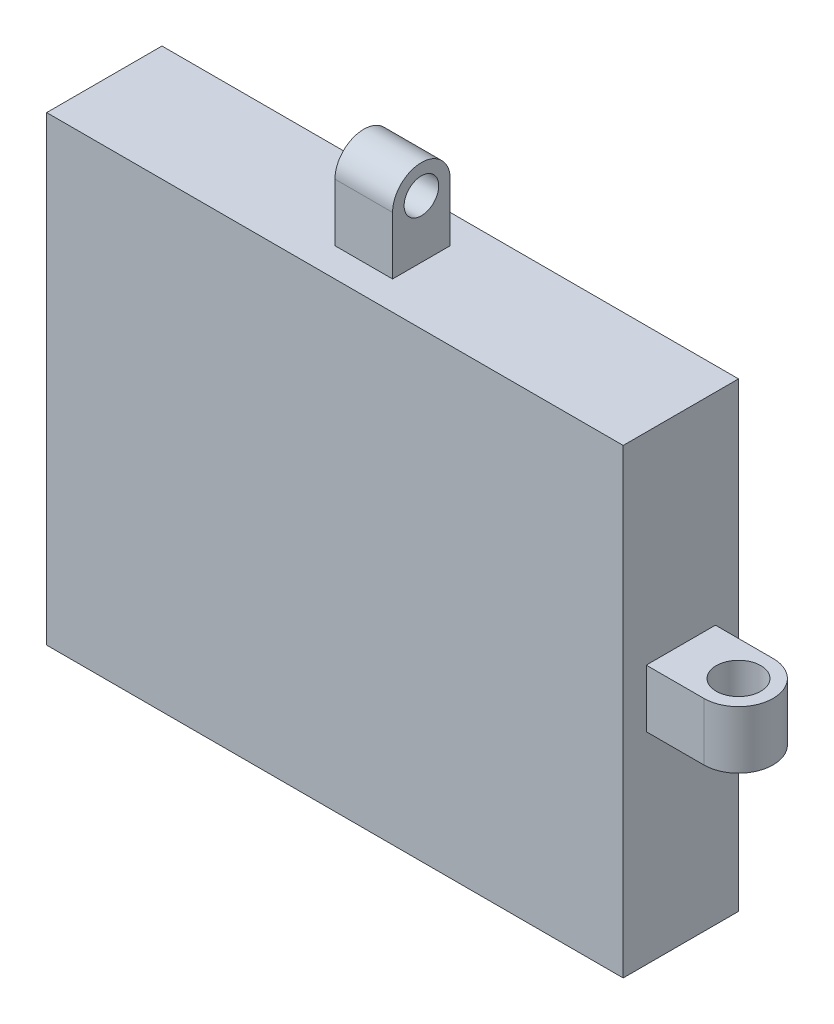
ISO-10303-21;
HEADER;
FILE_DESCRIPTION(('STEP AP214'),'2;1');
FILE_NAME('part.step','',(''),(''),'','','');
FILE_SCHEMA(('AUTOMOTIVE_DESIGN { 1 0 10303 214 1 1 1 1 }'));
ENDSEC;
DATA;
#1=APPLICATION_CONTEXT('core data for automotive mechanical design processes');
#2=APPLICATION_PROTOCOL_DEFINITION('international standard','automotive_design',2000,#1);
#3=PRODUCT_CONTEXT('',#1,'mechanical');
#4=PRODUCT('Part','Part','',(#3));
#5=PRODUCT_RELATED_PRODUCT_CATEGORY('part','',(#4));
#6=PRODUCT_DEFINITION_FORMATION('','',#4);
#7=PRODUCT_DEFINITION_CONTEXT('part definition',#1,'design');
#8=PRODUCT_DEFINITION('design','',#6,#7);
#9=PRODUCT_DEFINITION_SHAPE('','',#8);
#10=(LENGTH_UNIT() NAMED_UNIT(*) SI_UNIT(.MILLI.,.METRE.));
#11=(NAMED_UNIT(*) PLANE_ANGLE_UNIT() SI_UNIT($,.RADIAN.));
#12=(NAMED_UNIT(*) SI_UNIT($,.STERADIAN.) SOLID_ANGLE_UNIT());
#13=UNCERTAINTY_MEASURE_WITH_UNIT(LENGTH_MEASURE(1.E-05),#10,'distance_accuracy_value','');
#14=(GEOMETRIC_REPRESENTATION_CONTEXT(3) GLOBAL_UNCERTAINTY_ASSIGNED_CONTEXT((#13)) GLOBAL_UNIT_ASSIGNED_CONTEXT((#10,
#11,#12)) REPRESENTATION_CONTEXT('',''));
#15=CARTESIAN_POINT('',(0.,0.,0.));
#16=DIRECTION('',(0.,0.,1.));
#17=DIRECTION('',(1.,0.,0.));
#18=AXIS2_PLACEMENT_3D('',#15,#16,#17);
#19=CARTESIAN_POINT('',(3.38170104945569E-11,435.137931034487,0.));
#20=DIRECTION('',(0.,-1.,0.));
#21=DIRECTION('',(1.,0.,0.));
#22=AXIS2_PLACEMENT_3D('',#19,#20,#21);
#23=PLANE('',#22);
#24=CARTESIAN_POINT('',(28.531497042076,435.137931034485,5.00000000000001));
#25=DIRECTION('',(0.,1.,0.));
#26=DIRECTION('',(-1.,0.,0.));
#27=AXIS2_PLACEMENT_3D('',#24,#25,#26);
#28=CIRCLE('',#27,1.93089717066683);
#29=CARTESIAN_POINT('',(26.6005998714092,435.137931034485,5.00000000000001));
#30=VERTEX_POINT('',#29);
#31=EDGE_CURVE('E172',#30,#30,#28,.T.);
#32=ORIENTED_EDGE('',*,*,#31,.T.);
#33=EDGE_LOOP('',(#32));
#34=FACE_BOUND('',#33,.T.);
#35=DIRECTION('',(1.,0.,0.));
#36=VECTOR('',#35,1.);
#37=CARTESIAN_POINT('',(33.5314970420422,435.137931034485,2.));
#38=LINE('',#37,#36);
#39=CARTESIAN_POINT('',(23.5314970420747,435.137931034485,2.));
#40=VERTEX_POINT('',#39);
#41=CARTESIAN_POINT('',(28.531497042076,435.137931034485,2.));
#42=VERTEX_POINT('',#41);
#43=EDGE_CURVE('E155',#40,#42,#38,.T.);
#44=ORIENTED_EDGE('',*,*,#43,.T.);
#45=CARTESIAN_POINT('',(28.531497042076,435.137931034485,5.00000000000001));
#46=DIRECTION('',(0.,-1.,0.));
#47=DIRECTION('',(1.,0.,0.));
#48=AXIS2_PLACEMENT_3D('',#45,#46,#47);
#49=CIRCLE('',#48,3.00000000000001);
#50=CARTESIAN_POINT('',(28.531497042076,435.137931034485,8.));
#51=VERTEX_POINT('',#50);
#52=EDGE_CURVE('E494',#42,#51,#49,.T.);
#53=ORIENTED_EDGE('',*,*,#52,.T.);
#54=DIRECTION('',(-1.,0.,0.));
#55=VECTOR('',#54,1.);
#56=CARTESIAN_POINT('',(33.5314970420757,435.137931034485,8.));
#57=LINE('',#56,#55);
#58=CARTESIAN_POINT('',(23.5314970420747,435.137931034485,8.));
#59=VERTEX_POINT('',#58);
#60=EDGE_CURVE('E144',#51,#59,#57,.T.);
#61=ORIENTED_EDGE('',*,*,#60,.T.);
#62=DIRECTION('',(0.,0.,1.));
#63=VECTOR('',#62,1.);
#64=CARTESIAN_POINT('',(23.5314970420747,435.137931034485,-7.));
#65=LINE('',#64,#63);
#66=EDGE_CURVE('E157',#40,#59,#65,.T.);
#67=ORIENTED_EDGE('',*,*,#66,.F.);
#68=EDGE_LOOP('',(#44,#53,#61,#67));
#69=FACE_BOUND('',#68,.T.);
#70=ADVANCED_FACE('F41',(#34,#69),#23,.T.);
#71=CARTESIAN_POINT('',(3.42055885531757E-11,440.137931034487,0.));
#72=DIRECTION('',(0.,-1.,0.));
#73=DIRECTION('',(1.,0.,0.));
#74=AXIS2_PLACEMENT_3D('',#71,#72,#73);
#75=PLANE('',#74);
#76=CARTESIAN_POINT('',(28.5314970420764,440.137931034485,5.00000000000001));
#77=DIRECTION('',(0.,1.,0.));
#78=DIRECTION('',(-1.,0.,0.));
#79=AXIS2_PLACEMENT_3D('',#76,#77,#78);
#80=CIRCLE('',#79,1.93089717066683);
#81=CARTESIAN_POINT('',(26.6005998714096,440.137931034485,5.00000000000001));
#82=VERTEX_POINT('',#81);
#83=EDGE_CURVE('E173',#82,#82,#80,.T.);
#84=ORIENTED_EDGE('',*,*,#83,.F.);
#85=EDGE_LOOP('',(#84));
#86=FACE_BOUND('',#85,.T.);
#87=CARTESIAN_POINT('',(28.5314970420764,440.137931034485,5.00000000000001));
#88=DIRECTION('',(0.,1.,0.));
#89=DIRECTION('',(-1.,0.,0.));
#90=AXIS2_PLACEMENT_3D('',#87,#88,#89);
#91=CIRCLE('',#90,3.00000000000001);
#92=CARTESIAN_POINT('',(28.5314970420764,440.137931034485,8.));
#93=VERTEX_POINT('',#92);
#94=CARTESIAN_POINT('',(28.5314970420756,440.137931034485,2.));
#95=VERTEX_POINT('',#94);
#96=EDGE_CURVE('E128',#93,#95,#91,.T.);
#97=ORIENTED_EDGE('',*,*,#96,.T.);
#98=DIRECTION('',(1.,0.,0.));
#99=VECTOR('',#98,1.);
#100=CARTESIAN_POINT('',(33.5314970420422,440.137931034485,2.));
#101=LINE('',#100,#99);
#102=CARTESIAN_POINT('',(23.5314970420747,440.137931034485,2.));
#103=VERTEX_POINT('',#102);
#104=EDGE_CURVE('E169',#103,#95,#101,.T.);
#105=ORIENTED_EDGE('',*,*,#104,.F.);
#106=DIRECTION('',(0.,0.,1.));
#107=VECTOR('',#106,1.);
#108=CARTESIAN_POINT('',(23.5314970420747,440.137931034485,-7.));
#109=LINE('',#108,#107);
#110=CARTESIAN_POINT('',(23.5314970420747,440.137931034485,8.));
#111=VERTEX_POINT('',#110);
#112=EDGE_CURVE('E149',#103,#111,#109,.T.);
#113=ORIENTED_EDGE('',*,*,#112,.T.);
#114=DIRECTION('',(-1.,0.,0.));
#115=VECTOR('',#114,1.);
#116=CARTESIAN_POINT('',(33.5314970420768,440.137931034485,8.));
#117=LINE('',#116,#115);
#118=EDGE_CURVE('E142',#93,#111,#117,.T.);
#119=ORIENTED_EDGE('',*,*,#118,.F.);
#120=EDGE_LOOP('',(#97,#105,#113,#119));
#121=FACE_BOUND('',#120,.T.);
#122=ADVANCED_FACE('F147',(#86,#121),#75,.F.);
#123=CARTESIAN_POINT('',(-3.96850295792851,467.637931034483,2.5));
#124=DIRECTION('',(1.,0.,0.));
#125=DIRECTION('',(0.,0.,-1.));
#126=AXIS2_PLACEMENT_3D('',#123,#124,#125);
#127=PLANE('',#126);
#128=CARTESIAN_POINT('',(-3.96850295792851,462.637931034483,5.));
#129=DIRECTION('',(1.,0.,0.));
#130=DIRECTION('',(0.,0.,-1.));
#131=AXIS2_PLACEMENT_3D('',#128,#129,#130);
#132=CIRCLE('',#131,1.5);
#133=CARTESIAN_POINT('',(-3.96850295792851,462.637931034483,3.5));
#134=VERTEX_POINT('',#133);
#135=EDGE_CURVE('E467',#134,#134,#132,.T.);
#136=ORIENTED_EDGE('',*,*,#135,.T.);
#137=EDGE_LOOP('',(#136));
#138=FACE_BOUND('',#137,.T.);
#139=CARTESIAN_POINT('',(-3.96850295792851,462.637931034483,5.));
#140=DIRECTION('',(1.,0.,0.));
#141=DIRECTION('',(0.,0.,-1.));
#142=AXIS2_PLACEMENT_3D('',#139,#140,#141);
#143=CIRCLE('',#142,2.5);
#144=CARTESIAN_POINT('',(-3.96850295792851,462.637931034483,2.5));
#145=VERTEX_POINT('',#144);
#146=CARTESIAN_POINT('',(-3.96850295792851,462.637931034483,7.5));
#147=VERTEX_POINT('',#146);
#148=EDGE_CURVE('E444',#145,#147,#143,.T.);
#149=ORIENTED_EDGE('',*,*,#148,.F.);
#150=DIRECTION('',(0.,-1.,0.));
#151=VECTOR('',#150,1.);
#152=CARTESIAN_POINT('',(-3.96850295792851,467.637931034483,2.5));
#153=LINE('',#152,#151);
#154=CARTESIAN_POINT('',(-3.96850295792851,457.637931034483,2.5));
#155=VERTEX_POINT('',#154);
#156=EDGE_CURVE('E462',#145,#155,#153,.T.);
#157=ORIENTED_EDGE('',*,*,#156,.T.);
#158=DIRECTION('',(0.,0.,1.));
#159=VECTOR('',#158,1.);
#160=CARTESIAN_POINT('',(-3.96850295792851,457.637931034483,2.5));
#161=LINE('',#160,#159);
#162=CARTESIAN_POINT('',(-3.96850295792851,457.637931034483,7.5));
#163=VERTEX_POINT('',#162);
#164=EDGE_CURVE('E461',#155,#163,#161,.T.);
#165=ORIENTED_EDGE('',*,*,#164,.T.);
#166=DIRECTION('',(0.,-1.,0.));
#167=VECTOR('',#166,1.);
#168=CARTESIAN_POINT('',(-3.96850295792851,467.637931034483,7.5));
#169=LINE('',#168,#167);
#170=EDGE_CURVE('E227',#147,#163,#169,.T.);
#171=ORIENTED_EDGE('',*,*,#170,.F.);
#172=EDGE_LOOP('',(#149,#157,#165,#171));
#173=FACE_BOUND('',#172,.T.);
#174=ADVANCED_FACE('F259',(#138,#173),#127,.F.);
#175=CARTESIAN_POINT('',(-3.96850295792851,467.637931034483,7.5));
#176=DIRECTION('',(0.,0.,-1.));
#177=DIRECTION('',(-1.,0.,0.));
#178=AXIS2_PLACEMENT_3D('',#175,#176,#177);
#179=PLANE('',#178);
#180=DIRECTION('',(1.,0.,0.));
#181=VECTOR('',#180,1.);
#182=CARTESIAN_POINT('',(-8.9685029579222,462.637931034483,7.5));
#183=LINE('',#182,#181);
#184=CARTESIAN_POINT('',(1.0314970420778,462.637931034483,7.5));
#185=VERTEX_POINT('',#184);
#186=EDGE_CURVE('E446',#147,#185,#183,.T.);
#187=ORIENTED_EDGE('',*,*,#186,.F.);
#188=ORIENTED_EDGE('',*,*,#170,.T.);
#189=DIRECTION('',(1.,0.,0.));
#190=VECTOR('',#189,1.);
#191=CARTESIAN_POINT('',(-3.96850295792851,457.637931034483,7.5));
#192=LINE('',#191,#190);
#193=CARTESIAN_POINT('',(1.0314970420778,457.637931034483,7.5));
#194=VERTEX_POINT('',#193);
#195=EDGE_CURVE('E466',#163,#194,#192,.T.);
#196=ORIENTED_EDGE('',*,*,#195,.T.);
#197=DIRECTION('',(0.,-1.,0.));
#198=VECTOR('',#197,1.);
#199=CARTESIAN_POINT('',(1.0314970420778,467.637931034483,7.5));
#200=LINE('',#199,#198);
#201=EDGE_CURVE('E234',#185,#194,#200,.T.);
#202=ORIENTED_EDGE('',*,*,#201,.F.);
#203=EDGE_LOOP('',(#187,#188,#196,#202));
#204=FACE_BOUND('',#203,.T.);
#205=ADVANCED_FACE('F280',(#204),#179,.F.);
#206=CARTESIAN_POINT('',(1.0314970420778,467.637931034483,2.5));
#207=DIRECTION('',(-1.,0.,0.));
#208=DIRECTION('',(0.,0.,1.));
#209=AXIS2_PLACEMENT_3D('',#206,#207,#208);
#210=PLANE('',#209);
#211=CARTESIAN_POINT('',(1.0314970420778,462.637931034483,5.));
#212=DIRECTION('',(1.,0.,0.));
#213=DIRECTION('',(0.,0.,-1.));
#214=AXIS2_PLACEMENT_3D('',#211,#212,#213);
#215=CIRCLE('',#214,1.5);
#216=CARTESIAN_POINT('',(1.0314970420778,462.637931034483,3.5));
#217=VERTEX_POINT('',#216);
#218=EDGE_CURVE('E452',#217,#217,#215,.T.);
#219=ORIENTED_EDGE('',*,*,#218,.F.);
#220=EDGE_LOOP('',(#219));
#221=FACE_BOUND('',#220,.T.);
#222=CARTESIAN_POINT('',(1.0314970420778,462.637931034483,5.));
#223=DIRECTION('',(1.,0.,0.));
#224=DIRECTION('',(0.,0.,-1.));
#225=AXIS2_PLACEMENT_3D('',#222,#223,#224);
#226=CIRCLE('',#225,2.5);
#227=CARTESIAN_POINT('',(1.0314970420778,462.637931034483,2.5));
#228=VERTEX_POINT('',#227);
#229=EDGE_CURVE('E65',#228,#185,#226,.T.);
#230=ORIENTED_EDGE('',*,*,#229,.T.);
#231=ORIENTED_EDGE('',*,*,#201,.T.);
#232=DIRECTION('',(0.,0.,-1.));
#233=VECTOR('',#232,1.);
#234=CARTESIAN_POINT('',(1.0314970420778,457.637931034483,2.5));
#235=LINE('',#234,#233);
#236=CARTESIAN_POINT('',(1.0314970420778,457.637931034483,2.5));
#237=VERTEX_POINT('',#236);
#238=EDGE_CURVE('E471',#194,#237,#235,.T.);
#239=ORIENTED_EDGE('',*,*,#238,.T.);
#240=DIRECTION('',(0.,-1.,0.));
#241=VECTOR('',#240,1.);
#242=CARTESIAN_POINT('',(1.0314970420778,467.637931034483,2.5));
#243=LINE('',#242,#241);
#244=EDGE_CURVE('E485',#228,#237,#243,.T.);
#245=ORIENTED_EDGE('',*,*,#244,.F.);
#246=EDGE_LOOP('',(#230,#231,#239,#245));
#247=FACE_BOUND('',#246,.T.);
#248=ADVANCED_FACE('F275',(#221,#247),#210,.F.);
#249=CARTESIAN_POINT('',(-26.4685029579254,457.637931034483,10.));
#250=DIRECTION('',(0.,-1.,0.));
#251=DIRECTION('',(0.,0.,-1.));
#252=AXIS2_PLACEMENT_3D('',#249,#250,#251);
#253=PLANE('',#252);
#254=DIRECTION('',(-1.,0.,0.));
#255=VECTOR('',#254,1.);
#256=CARTESIAN_POINT('',(-26.4685029579254,457.637931034483,0.));
#257=LINE('',#256,#255);
#258=CARTESIAN_POINT('',(23.5314970420778,457.637931034483,0.));
#259=VERTEX_POINT('',#258);
#260=CARTESIAN_POINT('',(-26.4685029579285,457.637931034483,0.));
#261=VERTEX_POINT('',#260);
#262=EDGE_CURVE('E192',#259,#261,#257,.T.);
#263=ORIENTED_EDGE('',*,*,#262,.T.);
#264=DIRECTION('',(0.,0.,-1.));
#265=VECTOR('',#264,1.);
#266=CARTESIAN_POINT('',(-26.4685029579285,457.637931034483,10.));
#267=LINE('',#266,#265);
#268=CARTESIAN_POINT('',(-26.4685029579285,457.637931034483,10.));
#269=VERTEX_POINT('',#268);
#270=EDGE_CURVE('E160',#269,#261,#267,.T.);
#271=ORIENTED_EDGE('',*,*,#270,.F.);
#272=DIRECTION('',(-1.,0.,0.));
#273=VECTOR('',#272,1.);
#274=CARTESIAN_POINT('',(-26.4685029579254,457.637931034483,10.));
#275=LINE('',#274,#273);
#276=CARTESIAN_POINT('',(23.5314970420778,457.637931034483,10.));
#277=VERTEX_POINT('',#276);
#278=EDGE_CURVE('E195',#277,#269,#275,.T.);
#279=ORIENTED_EDGE('',*,*,#278,.F.);
#280=DIRECTION('',(0.,0.,-1.));
#281=VECTOR('',#280,1.);
#282=CARTESIAN_POINT('',(23.5314970420778,457.637931034483,10.));
#283=LINE('',#282,#281);
#284=EDGE_CURVE('E50',#277,#259,#283,.T.);
#285=ORIENTED_EDGE('',*,*,#284,.T.);
#286=EDGE_LOOP('',(#263,#271,#279,#285));
#287=FACE_BOUND('',#286,.T.);
#288=ORIENTED_EDGE('',*,*,#164,.F.);
#289=DIRECTION('',(-1.,0.,0.));
#290=VECTOR('',#289,1.);
#291=CARTESIAN_POINT('',(-3.96850295792851,457.637931034483,2.5));
#292=LINE('',#291,#290);
#293=EDGE_CURVE('E480',#237,#155,#292,.T.);
#294=ORIENTED_EDGE('',*,*,#293,.F.);
#295=ORIENTED_EDGE('',*,*,#238,.F.);
#296=ORIENTED_EDGE('',*,*,#195,.F.);
#297=EDGE_LOOP('',(#288,#294,#295,#296));
#298=FACE_BOUND('',#297,.T.);
#299=ADVANCED_FACE('F210',(#287,#298),#253,.F.);
#300=CARTESIAN_POINT('',(33.5314970420422,-2.60708386863427E-12,2.));
#301=DIRECTION('',(0.,0.,-1.));
#302=DIRECTION('',(-1.,0.,0.));
#303=AXIS2_PLACEMENT_3D('',#300,#301,#302);
#304=PLANE('',#303);
#305=DIRECTION('',(0.,1.,0.));
#306=VECTOR('',#305,1.);
#307=CARTESIAN_POINT('',(28.5314970420756,430.137931034485,2.));
#308=LINE('',#307,#306);
#309=EDGE_CURVE('E57',#42,#95,#308,.T.);
#310=ORIENTED_EDGE('',*,*,#309,.F.);
#311=ORIENTED_EDGE('',*,*,#43,.F.);
#312=DIRECTION('',(0.,-1.,0.));
#313=VECTOR('',#312,1.);
#314=CARTESIAN_POINT('',(23.5314970420422,-1.82992775139664E-12,2.));
#315=LINE('',#314,#313);
#316=EDGE_CURVE('E177',#103,#40,#315,.T.);
#317=ORIENTED_EDGE('',*,*,#316,.F.);
#318=ORIENTED_EDGE('',*,*,#104,.T.);
#319=EDGE_LOOP('',(#310,#311,#317,#318));
#320=FACE_BOUND('',#319,.T.);
#321=ADVANCED_FACE('F267',(#320),#304,.T.);
#322=CARTESIAN_POINT('',(33.5314970420422,-2.60708386863427E-12,8.));
#323=DIRECTION('',(0.,0.,-1.));
#324=DIRECTION('',(-1.,0.,0.));
#325=AXIS2_PLACEMENT_3D('',#322,#323,#324);
#326=PLANE('',#325);
#327=ORIENTED_EDGE('',*,*,#60,.F.);
#328=DIRECTION('',(0.,1.,0.));
#329=VECTOR('',#328,1.);
#330=CARTESIAN_POINT('',(28.5314970420756,430.137931034485,8.));
#331=LINE('',#330,#329);
#332=EDGE_CURVE('E131',#51,#93,#331,.T.);
#333=ORIENTED_EDGE('',*,*,#332,.T.);
#334=ORIENTED_EDGE('',*,*,#118,.T.);
#335=DIRECTION('',(0.,-1.,0.));
#336=VECTOR('',#335,1.);
#337=CARTESIAN_POINT('',(23.5314970420422,-1.82992775139664E-12,8.));
#338=LINE('',#337,#336);
#339=EDGE_CURVE('E184',#111,#59,#338,.T.);
#340=ORIENTED_EDGE('',*,*,#339,.T.);
#341=EDGE_LOOP('',(#327,#333,#334,#340));
#342=FACE_BOUND('',#341,.T.);
#343=ADVANCED_FACE('F140',(#342),#326,.F.);
#344=CARTESIAN_POINT('',(23.5314970420778,457.637931034483,10.));
#345=DIRECTION('',(-1.,0.,0.));
#346=DIRECTION('',(0.,-1.,0.));
#347=AXIS2_PLACEMENT_3D('',#344,#345,#346);
#348=PLANE('',#347);
#349=DIRECTION('',(0.,1.,0.));
#350=VECTOR('',#349,1.);
#351=CARTESIAN_POINT('',(23.5314970420778,457.637931034483,0.));
#352=LINE('',#351,#350);
#353=CARTESIAN_POINT('',(23.5314970420747,417.637931034484,0.));
#354=VERTEX_POINT('',#353);
#355=EDGE_CURVE('E200',#354,#259,#352,.T.);
#356=ORIENTED_EDGE('',*,*,#355,.T.);
#357=ORIENTED_EDGE('',*,*,#284,.F.);
#358=DIRECTION('',(0.,1.,0.));
#359=VECTOR('',#358,1.);
#360=CARTESIAN_POINT('',(23.5314970420778,457.637931034483,10.));
#361=LINE('',#360,#359);
#362=CARTESIAN_POINT('',(23.5314970420747,417.637931034484,10.));
#363=VERTEX_POINT('',#362);
#364=EDGE_CURVE('E191',#363,#277,#361,.T.);
#365=ORIENTED_EDGE('',*,*,#364,.F.);
#366=DIRECTION('',(0.,0.,-1.));
#367=VECTOR('',#366,1.);
#368=CARTESIAN_POINT('',(23.5314970420747,417.637931034484,10.));
#369=LINE('',#368,#367);
#370=EDGE_CURVE('E11',#363,#354,#369,.T.);
#371=ORIENTED_EDGE('',*,*,#370,.T.);
#372=EDGE_LOOP('',(#356,#357,#365,#371));
#373=FACE_BOUND('',#372,.T.);
#374=ORIENTED_EDGE('',*,*,#112,.F.);
#375=ORIENTED_EDGE('',*,*,#316,.T.);
#376=ORIENTED_EDGE('',*,*,#66,.T.);
#377=ORIENTED_EDGE('',*,*,#339,.F.);
#378=EDGE_LOOP('',(#374,#375,#376,#377));
#379=FACE_BOUND('',#378,.T.);
#380=ADVANCED_FACE('F244',(#373,#379),#348,.F.);
#381=CARTESIAN_POINT('',(-26.4685029579254,417.637931034484,10.));
#382=DIRECTION('',(0.,1.,0.));
#383=DIRECTION('',(0.,0.,1.));
#384=AXIS2_PLACEMENT_3D('',#381,#382,#383);
#385=PLANE('',#384);
#386=DIRECTION('',(1.,0.,0.));
#387=VECTOR('',#386,1.);
#388=CARTESIAN_POINT('',(-26.4685029579254,417.637931034484,10.));
#389=LINE('',#388,#387);
#390=CARTESIAN_POINT('',(-26.4685029579254,417.637931034484,10.));
#391=VERTEX_POINT('',#390);
#392=EDGE_CURVE('E188',#391,#363,#389,.T.);
#393=ORIENTED_EDGE('',*,*,#392,.F.);
#394=DIRECTION('',(0.,0.,-1.));
#395=VECTOR('',#394,1.);
#396=CARTESIAN_POINT('',(-26.4685029579254,417.637931034484,10.));
#397=LINE('',#396,#395);
#398=CARTESIAN_POINT('',(-26.4685029579254,417.637931034484,0.));
#399=VERTEX_POINT('',#398);
#400=EDGE_CURVE('E232',#391,#399,#397,.T.);
#401=ORIENTED_EDGE('',*,*,#400,.T.);
#402=DIRECTION('',(1.,0.,0.));
#403=VECTOR('',#402,1.);
#404=CARTESIAN_POINT('',(-26.4685029579254,417.637931034484,0.));
#405=LINE('',#404,#403);
#406=EDGE_CURVE('E187',#399,#354,#405,.T.);
#407=ORIENTED_EDGE('',*,*,#406,.T.);
#408=ORIENTED_EDGE('',*,*,#370,.F.);
#409=EDGE_LOOP('',(#393,#401,#407,#408));
#410=FACE_BOUND('',#409,.T.);
#411=ADVANCED_FACE('F43',(#410),#385,.F.);
#412=CARTESIAN_POINT('',(0.,0.,10.));
#413=DIRECTION('',(0.,0.,1.));
#414=DIRECTION('',(1.,0.,0.));
#415=AXIS2_PLACEMENT_3D('',#412,#413,#414);
#416=PLANE('',#415);
#417=ORIENTED_EDGE('',*,*,#278,.T.);
#418=DIRECTION('',(0.,1.,0.));
#419=VECTOR('',#418,1.);
#420=CARTESIAN_POINT('',(-26.4685029579285,457.637931034483,10.));
#421=LINE('',#420,#419);
#422=EDGE_CURVE('E226',#391,#269,#421,.T.);
#423=ORIENTED_EDGE('',*,*,#422,.F.);
#424=ORIENTED_EDGE('',*,*,#392,.T.);
#425=ORIENTED_EDGE('',*,*,#364,.T.);
#426=EDGE_LOOP('',(#417,#423,#424,#425));
#427=FACE_BOUND('',#426,.T.);
#428=ADVANCED_FACE('F242',(#427),#416,.T.);
#429=CARTESIAN_POINT('',(0.,0.,0.));
#430=DIRECTION('',(0.,0.,1.));
#431=DIRECTION('',(1.,0.,0.));
#432=AXIS2_PLACEMENT_3D('',#429,#430,#431);
#433=PLANE('',#432);
#434=ORIENTED_EDGE('',*,*,#406,.F.);
#435=DIRECTION('',(0.,1.,0.));
#436=VECTOR('',#435,1.);
#437=CARTESIAN_POINT('',(-26.4685029579285,457.637931034483,0.));
#438=LINE('',#437,#436);
#439=EDGE_CURVE('E221',#399,#261,#438,.T.);
#440=ORIENTED_EDGE('',*,*,#439,.T.);
#441=ORIENTED_EDGE('',*,*,#262,.F.);
#442=ORIENTED_EDGE('',*,*,#355,.F.);
#443=EDGE_LOOP('',(#434,#440,#441,#442));
#444=FACE_BOUND('',#443,.T.);
#445=ADVANCED_FACE('F219',(#444),#433,.F.);
#446=CARTESIAN_POINT('',(28.5314970420764,440.137931034485,5.00000000000001));
#447=DIRECTION('',(0.,-1.,0.));
#448=DIRECTION('',(1.,0.,0.));
#449=AXIS2_PLACEMENT_3D('',#446,#447,#448);
#450=CYLINDRICAL_SURFACE('',#449,1.93089717066683);
#451=ORIENTED_EDGE('',*,*,#83,.T.);
#452=EDGE_LOOP('',(#451));
#453=FACE_BOUND('',#452,.T.);
#454=ORIENTED_EDGE('',*,*,#31,.F.);
#455=EDGE_LOOP('',(#454));
#456=FACE_BOUND('',#455,.T.);
#457=ADVANCED_FACE('F273',(#453,#456),#450,.F.);
#458=CARTESIAN_POINT('',(-26.4685029579285,457.637931034483,10.));
#459=DIRECTION('',(-1.,0.,0.));
#460=DIRECTION('',(0.,-1.,0.));
#461=AXIS2_PLACEMENT_3D('',#458,#459,#460);
#462=PLANE('',#461);
#463=ORIENTED_EDGE('',*,*,#439,.F.);
#464=ORIENTED_EDGE('',*,*,#400,.F.);
#465=ORIENTED_EDGE('',*,*,#422,.T.);
#466=ORIENTED_EDGE('',*,*,#270,.T.);
#467=EDGE_LOOP('',(#463,#464,#465,#466));
#468=FACE_BOUND('',#467,.T.);
#469=ADVANCED_FACE('F239',(#468),#462,.T.);
#470=CARTESIAN_POINT('',(-3.96850295792851,467.637931034483,2.5));
#471=DIRECTION('',(0.,0.,1.));
#472=DIRECTION('',(1.,0.,0.));
#473=AXIS2_PLACEMENT_3D('',#470,#471,#472);
#474=PLANE('',#473);
#475=ORIENTED_EDGE('',*,*,#156,.F.);
#476=DIRECTION('',(1.,0.,0.));
#477=VECTOR('',#476,1.);
#478=CARTESIAN_POINT('',(-8.9685029579222,462.637931034483,2.5));
#479=LINE('',#478,#477);
#480=EDGE_CURVE('E447',#145,#228,#479,.T.);
#481=ORIENTED_EDGE('',*,*,#480,.T.);
#482=ORIENTED_EDGE('',*,*,#244,.T.);
#483=ORIENTED_EDGE('',*,*,#293,.T.);
#484=EDGE_LOOP('',(#475,#481,#482,#483));
#485=FACE_BOUND('',#484,.T.);
#486=ADVANCED_FACE('F292',(#485),#474,.F.);
#487=CARTESIAN_POINT('',(-8.9685029579222,462.637931034483,5.));
#488=DIRECTION('',(1.,0.,0.));
#489=DIRECTION('',(0.,0.,-1.));
#490=AXIS2_PLACEMENT_3D('',#487,#488,#489);
#491=CYLINDRICAL_SURFACE('',#490,1.5);
#492=ORIENTED_EDGE('',*,*,#218,.T.);
#493=EDGE_LOOP('',(#492));
#494=FACE_BOUND('',#493,.T.);
#495=ORIENTED_EDGE('',*,*,#135,.F.);
#496=EDGE_LOOP('',(#495));
#497=FACE_BOUND('',#496,.T.);
#498=ADVANCED_FACE('F319',(#494,#497),#491,.F.);
#499=CARTESIAN_POINT('',(-8.9685029579222,462.637931034483,5.));
#500=DIRECTION('',(1.,0.,0.));
#501=DIRECTION('',(0.,0.,-1.));
#502=AXIS2_PLACEMENT_3D('',#499,#500,#501);
#503=CYLINDRICAL_SURFACE('',#502,2.5);
#504=ORIENTED_EDGE('',*,*,#148,.T.);
#505=ORIENTED_EDGE('',*,*,#186,.T.);
#506=ORIENTED_EDGE('',*,*,#229,.F.);
#507=ORIENTED_EDGE('',*,*,#480,.F.);
#508=EDGE_LOOP('',(#504,#505,#506,#507));
#509=FACE_BOUND('',#508,.T.);
#510=ADVANCED_FACE('F329',(#509),#503,.T.);
#511=CARTESIAN_POINT('',(28.5314970420756,430.137931034485,5.00000000000001));
#512=DIRECTION('',(0.,1.,0.));
#513=DIRECTION('',(-1.,0.,0.));
#514=AXIS2_PLACEMENT_3D('',#511,#512,#513);
#515=CYLINDRICAL_SURFACE('',#514,3.00000000000001);
#516=ORIENTED_EDGE('',*,*,#309,.T.);
#517=ORIENTED_EDGE('',*,*,#96,.F.);
#518=ORIENTED_EDGE('',*,*,#332,.F.);
#519=ORIENTED_EDGE('',*,*,#52,.F.);
#520=EDGE_LOOP('',(#516,#517,#518,#519));
#521=FACE_BOUND('',#520,.T.);
#522=ADVANCED_FACE('F130',(#521),#515,.T.);
#523=CLOSED_SHELL('',(#70,#122,#174,#205,#248,#299,#321,#343,#380,#411,#428,#445,#457,#469,#486,
#498,#510,#522));
#524=MANIFOLD_SOLID_BREP('B2',#523);
#525=ADVANCED_BREP_SHAPE_REPRESENTATION('',(#18,#524),#14);
#526=SHAPE_DEFINITION_REPRESENTATION(#9,#525);
ENDSEC;
END-ISO-10303-21;
